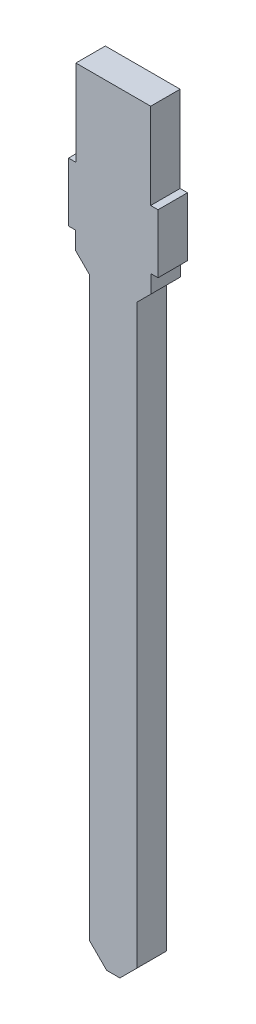
ISO-10303-21;
HEADER;
FILE_DESCRIPTION(('STEP AP214'),'2;1');
FILE_NAME('part.step','',(''),(''),'','','');
FILE_SCHEMA(('AUTOMOTIVE_DESIGN { 1 0 10303 214 1 1 1 1 }'));
ENDSEC;
DATA;
#1=APPLICATION_CONTEXT('core data for automotive mechanical design processes');
#2=APPLICATION_PROTOCOL_DEFINITION('international standard','automotive_design',2000,#1);
#3=PRODUCT_CONTEXT('',#1,'mechanical');
#4=PRODUCT('Part','Part','',(#3));
#5=PRODUCT_RELATED_PRODUCT_CATEGORY('part','',(#4));
#6=PRODUCT_DEFINITION_FORMATION('','',#4);
#7=PRODUCT_DEFINITION_CONTEXT('part definition',#1,'design');
#8=PRODUCT_DEFINITION('design','',#6,#7);
#9=PRODUCT_DEFINITION_SHAPE('','',#8);
#10=(LENGTH_UNIT() NAMED_UNIT(*) SI_UNIT(.MILLI.,.METRE.));
#11=(NAMED_UNIT(*) PLANE_ANGLE_UNIT() SI_UNIT($,.RADIAN.));
#12=(NAMED_UNIT(*) SI_UNIT($,.STERADIAN.) SOLID_ANGLE_UNIT());
#13=UNCERTAINTY_MEASURE_WITH_UNIT(LENGTH_MEASURE(1.E-05),#10,'distance_accuracy_value','');
#14=(GEOMETRIC_REPRESENTATION_CONTEXT(3) GLOBAL_UNCERTAINTY_ASSIGNED_CONTEXT((#13)) GLOBAL_UNIT_ASSIGNED_CONTEXT((#10,
#11,#12)) REPRESENTATION_CONTEXT('',''));
#15=CARTESIAN_POINT('',(0.,0.,0.));
#16=DIRECTION('',(0.,0.,1.));
#17=DIRECTION('',(1.,0.,0.));
#18=AXIS2_PLACEMENT_3D('',#15,#16,#17);
#19=CARTESIAN_POINT('',(0.399999999999999,0.287838254692783,0.5));
#20=DIRECTION('',(-0.707106781186547,0.707106781186547,0.));
#21=DIRECTION('',(-0.707106781186548,-0.707106781186548,0.));
#22=AXIS2_PLACEMENT_3D('',#19,#20,#21);
#23=PLANE('',#22);
#24=DIRECTION('',(0.707106781186547,0.707106781186547,0.));
#25=VECTOR('',#24,1.);
#26=CARTESIAN_POINT('',(0.399999999999999,0.287838254692783,0.));
#27=LINE('',#26,#25);
#28=CARTESIAN_POINT('',(0.112161745307216,0.,0.));
#29=VERTEX_POINT('',#28);
#30=CARTESIAN_POINT('',(0.399999999999999,0.287838254692783,0.));
#31=VERTEX_POINT('',#30);
#32=EDGE_CURVE('E191',#29,#31,#27,.T.);
#33=ORIENTED_EDGE('',*,*,#32,.T.);
#34=DIRECTION('',(0.,0.,-1.));
#35=VECTOR('',#34,1.);
#36=CARTESIAN_POINT('',(0.399999999999999,0.287838254692783,0.5));
#37=LINE('',#36,#35);
#38=CARTESIAN_POINT('',(0.399999999999999,0.287838254692783,0.5));
#39=VERTEX_POINT('',#38);
#40=EDGE_CURVE('E11',#39,#31,#37,.T.);
#41=ORIENTED_EDGE('',*,*,#40,.F.);
#42=DIRECTION('',(0.707106781186547,0.707106781186547,0.));
#43=VECTOR('',#42,1.);
#44=CARTESIAN_POINT('',(0.399999999999999,0.287838254692783,0.5));
#45=LINE('',#44,#43);
#46=CARTESIAN_POINT('',(0.112161745307216,0.,0.5));
#47=VERTEX_POINT('',#46);
#48=EDGE_CURVE('E225',#47,#39,#45,.T.);
#49=ORIENTED_EDGE('',*,*,#48,.F.);
#50=DIRECTION('',(0.,0.,-1.));
#51=VECTOR('',#50,1.);
#52=CARTESIAN_POINT('',(0.112161745307216,0.,0.5));
#53=LINE('',#52,#51);
#54=EDGE_CURVE('E187',#47,#29,#53,.T.);
#55=ORIENTED_EDGE('',*,*,#54,.T.);
#56=EDGE_LOOP('',(#33,#41,#49,#55));
#57=FACE_BOUND('',#56,.T.);
#58=ADVANCED_FACE('F35',(#57),#23,.F.);
#59=CARTESIAN_POINT('',(0.399999999999999,10.08,0.5));
#60=DIRECTION('',(-1.,0.,0.));
#61=DIRECTION('',(0.,0.,1.));
#62=AXIS2_PLACEMENT_3D('',#59,#60,#61);
#63=PLANE('',#62);
#64=DIRECTION('',(0.,1.,0.));
#65=VECTOR('',#64,1.);
#66=CARTESIAN_POINT('',(0.399999999999999,10.08,0.));
#67=LINE('',#66,#65);
#68=CARTESIAN_POINT('',(0.399999999999999,10.08,0.));
#69=VERTEX_POINT('',#68);
#70=EDGE_CURVE('E194',#31,#69,#67,.T.);
#71=ORIENTED_EDGE('',*,*,#70,.T.);
#72=DIRECTION('',(0.,0.,-1.));
#73=VECTOR('',#72,1.);
#74=CARTESIAN_POINT('',(0.399999999999999,10.08,0.5));
#75=LINE('',#74,#73);
#76=CARTESIAN_POINT('',(0.399999999999999,10.08,0.5));
#77=VERTEX_POINT('',#76);
#78=EDGE_CURVE('E43',#77,#69,#75,.T.);
#79=ORIENTED_EDGE('',*,*,#78,.F.);
#80=DIRECTION('',(0.,1.,0.));
#81=VECTOR('',#80,1.);
#82=CARTESIAN_POINT('',(0.399999999999999,10.08,0.5));
#83=LINE('',#82,#81);
#84=EDGE_CURVE('E124',#39,#77,#83,.T.);
#85=ORIENTED_EDGE('',*,*,#84,.F.);
#86=ORIENTED_EDGE('',*,*,#40,.T.);
#87=EDGE_LOOP('',(#71,#79,#85,#86));
#88=FACE_BOUND('',#87,.T.);
#89=ADVANCED_FACE('F333',(#88),#63,.F.);
#90=CARTESIAN_POINT('',(0.643038214383101,10.3230382143831,0.5));
#91=DIRECTION('',(-0.707106781186543,0.707106781186552,0.));
#92=DIRECTION('',(-0.707106781186552,-0.707106781186543,0.));
#93=AXIS2_PLACEMENT_3D('',#90,#91,#92);
#94=PLANE('',#93);
#95=DIRECTION('',(0.707106781186552,0.707106781186543,0.));
#96=VECTOR('',#95,1.);
#97=CARTESIAN_POINT('',(0.643038214383101,10.3230382143831,0.));
#98=LINE('',#97,#96);
#99=CARTESIAN_POINT('',(0.643038214383101,10.3230382143831,0.));
#100=VERTEX_POINT('',#99);
#101=EDGE_CURVE('E196',#69,#100,#98,.T.);
#102=ORIENTED_EDGE('',*,*,#101,.T.);
#103=DIRECTION('',(0.,0.,-1.));
#104=VECTOR('',#103,1.);
#105=CARTESIAN_POINT('',(0.643038214383101,10.3230382143831,0.5));
#106=LINE('',#105,#104);
#107=CARTESIAN_POINT('',(0.643038214383101,10.3230382143831,0.5));
#108=VERTEX_POINT('',#107);
#109=EDGE_CURVE('E262',#108,#100,#106,.T.);
#110=ORIENTED_EDGE('',*,*,#109,.F.);
#111=DIRECTION('',(0.707106781186552,0.707106781186543,0.));
#112=VECTOR('',#111,1.);
#113=CARTESIAN_POINT('',(0.643038214383101,10.3230382143831,0.5));
#114=LINE('',#113,#112);
#115=EDGE_CURVE('E270',#77,#108,#114,.T.);
#116=ORIENTED_EDGE('',*,*,#115,.F.);
#117=ORIENTED_EDGE('',*,*,#78,.T.);
#118=EDGE_LOOP('',(#102,#110,#116,#117));
#119=FACE_BOUND('',#118,.T.);
#120=ADVANCED_FACE('F268',(#119),#94,.F.);
#121=CARTESIAN_POINT('',(0.643038214383107,10.62,0.5));
#122=DIRECTION('',(-1.,0.,0.));
#123=DIRECTION('',(0.,-1.,0.));
#124=AXIS2_PLACEMENT_3D('',#121,#122,#123);
#125=PLANE('',#124);
#126=DIRECTION('',(0.,1.,0.));
#127=VECTOR('',#126,1.);
#128=CARTESIAN_POINT('',(0.643038214383107,10.62,0.));
#129=LINE('',#128,#127);
#130=CARTESIAN_POINT('',(0.643038214383107,10.62,0.));
#131=VERTEX_POINT('',#130);
#132=EDGE_CURVE('E198',#100,#131,#129,.T.);
#133=ORIENTED_EDGE('',*,*,#132,.T.);
#134=DIRECTION('',(0.,0.,-1.));
#135=VECTOR('',#134,1.);
#136=CARTESIAN_POINT('',(0.643038214383107,10.62,0.5));
#137=LINE('',#136,#135);
#138=CARTESIAN_POINT('',(0.643038214383107,10.62,0.5));
#139=VERTEX_POINT('',#138);
#140=EDGE_CURVE('E259',#139,#131,#137,.T.);
#141=ORIENTED_EDGE('',*,*,#140,.F.);
#142=DIRECTION('',(0.,1.,0.));
#143=VECTOR('',#142,1.);
#144=CARTESIAN_POINT('',(0.643038214383107,10.62,0.5));
#145=LINE('',#144,#143);
#146=EDGE_CURVE('E288',#108,#139,#145,.T.);
#147=ORIENTED_EDGE('',*,*,#146,.F.);
#148=ORIENTED_EDGE('',*,*,#109,.T.);
#149=EDGE_LOOP('',(#133,#141,#147,#148));
#150=FACE_BOUND('',#149,.T.);
#151=ADVANCED_FACE('F279',(#150),#125,.F.);
#152=CARTESIAN_POINT('',(0.759999999999999,10.62,0.5));
#153=DIRECTION('',(0.,1.,0.));
#154=DIRECTION('',(0.,0.,1.));
#155=AXIS2_PLACEMENT_3D('',#152,#153,#154);
#156=PLANE('',#155);
#157=DIRECTION('',(1.,0.,0.));
#158=VECTOR('',#157,1.);
#159=CARTESIAN_POINT('',(0.759999999999999,10.62,0.));
#160=LINE('',#159,#158);
#161=CARTESIAN_POINT('',(0.759999999999999,10.62,0.));
#162=VERTEX_POINT('',#161);
#163=EDGE_CURVE('E200',#131,#162,#160,.T.);
#164=ORIENTED_EDGE('',*,*,#163,.T.);
#165=DIRECTION('',(0.,0.,-1.));
#166=VECTOR('',#165,1.);
#167=CARTESIAN_POINT('',(0.759999999999999,10.62,0.5));
#168=LINE('',#167,#166);
#169=CARTESIAN_POINT('',(0.759999999999999,10.62,0.5));
#170=VERTEX_POINT('',#169);
#171=EDGE_CURVE('E256',#170,#162,#168,.T.);
#172=ORIENTED_EDGE('',*,*,#171,.F.);
#173=DIRECTION('',(1.,0.,0.));
#174=VECTOR('',#173,1.);
#175=CARTESIAN_POINT('',(0.759999999999999,10.62,0.5));
#176=LINE('',#175,#174);
#177=EDGE_CURVE('E285',#139,#170,#176,.T.);
#178=ORIENTED_EDGE('',*,*,#177,.F.);
#179=ORIENTED_EDGE('',*,*,#140,.T.);
#180=EDGE_LOOP('',(#164,#172,#178,#179));
#181=FACE_BOUND('',#180,.T.);
#182=ADVANCED_FACE('F283',(#181),#156,.F.);
#183=CARTESIAN_POINT('',(0.759999999999999,11.62,0.5));
#184=DIRECTION('',(-1.,0.,0.));
#185=DIRECTION('',(0.,-1.,0.));
#186=AXIS2_PLACEMENT_3D('',#183,#184,#185);
#187=PLANE('',#186);
#188=DIRECTION('',(0.,1.,0.));
#189=VECTOR('',#188,1.);
#190=CARTESIAN_POINT('',(0.759999999999999,11.62,0.));
#191=LINE('',#190,#189);
#192=CARTESIAN_POINT('',(0.759999999999999,11.62,0.));
#193=VERTEX_POINT('',#192);
#194=EDGE_CURVE('E202',#162,#193,#191,.T.);
#195=ORIENTED_EDGE('',*,*,#194,.T.);
#196=DIRECTION('',(0.,0.,-1.));
#197=VECTOR('',#196,1.);
#198=CARTESIAN_POINT('',(0.759999999999999,11.62,0.5));
#199=LINE('',#198,#197);
#200=CARTESIAN_POINT('',(0.759999999999999,11.62,0.5));
#201=VERTEX_POINT('',#200);
#202=EDGE_CURVE('E253',#201,#193,#199,.T.);
#203=ORIENTED_EDGE('',*,*,#202,.F.);
#204=DIRECTION('',(0.,1.,0.));
#205=VECTOR('',#204,1.);
#206=CARTESIAN_POINT('',(0.759999999999999,11.62,0.5));
#207=LINE('',#206,#205);
#208=EDGE_CURVE('E287',#170,#201,#207,.T.);
#209=ORIENTED_EDGE('',*,*,#208,.F.);
#210=ORIENTED_EDGE('',*,*,#171,.T.);
#211=EDGE_LOOP('',(#195,#203,#209,#210));
#212=FACE_BOUND('',#211,.T.);
#213=ADVANCED_FACE('F346',(#212),#187,.F.);
#214=CARTESIAN_POINT('',(0.635,11.62,0.5));
#215=DIRECTION('',(0.,-1.,0.));
#216=DIRECTION('',(0.,0.,-1.));
#217=AXIS2_PLACEMENT_3D('',#214,#215,#216);
#218=PLANE('',#217);
#219=DIRECTION('',(-1.,0.,0.));
#220=VECTOR('',#219,1.);
#221=CARTESIAN_POINT('',(0.635,11.62,0.));
#222=LINE('',#221,#220);
#223=CARTESIAN_POINT('',(0.635,11.62,0.));
#224=VERTEX_POINT('',#223);
#225=EDGE_CURVE('E204',#193,#224,#222,.T.);
#226=ORIENTED_EDGE('',*,*,#225,.T.);
#227=DIRECTION('',(0.,0.,-1.));
#228=VECTOR('',#227,1.);
#229=CARTESIAN_POINT('',(0.635,11.62,0.5));
#230=LINE('',#229,#228);
#231=CARTESIAN_POINT('',(0.635,11.62,0.5));
#232=VERTEX_POINT('',#231);
#233=EDGE_CURVE('E250',#232,#224,#230,.T.);
#234=ORIENTED_EDGE('',*,*,#233,.F.);
#235=DIRECTION('',(-1.,0.,0.));
#236=VECTOR('',#235,1.);
#237=CARTESIAN_POINT('',(0.635,11.62,0.5));
#238=LINE('',#237,#236);
#239=EDGE_CURVE('E290',#201,#232,#238,.T.);
#240=ORIENTED_EDGE('',*,*,#239,.F.);
#241=ORIENTED_EDGE('',*,*,#202,.T.);
#242=EDGE_LOOP('',(#226,#234,#240,#241));
#243=FACE_BOUND('',#242,.T.);
#244=ADVANCED_FACE('F349',(#243),#218,.F.);
#245=CARTESIAN_POINT('',(0.635,13.08,0.5));
#246=DIRECTION('',(-1.,0.,0.));
#247=DIRECTION('',(0.,-1.,0.));
#248=AXIS2_PLACEMENT_3D('',#245,#246,#247);
#249=PLANE('',#248);
#250=DIRECTION('',(0.,1.,0.));
#251=VECTOR('',#250,1.);
#252=CARTESIAN_POINT('',(0.635,13.08,0.));
#253=LINE('',#252,#251);
#254=CARTESIAN_POINT('',(0.635,13.08,0.));
#255=VERTEX_POINT('',#254);
#256=EDGE_CURVE('E206',#224,#255,#253,.T.);
#257=ORIENTED_EDGE('',*,*,#256,.T.);
#258=DIRECTION('',(0.,0.,-1.));
#259=VECTOR('',#258,1.);
#260=CARTESIAN_POINT('',(0.635,13.08,0.5));
#261=LINE('',#260,#259);
#262=CARTESIAN_POINT('',(0.635,13.08,0.5));
#263=VERTEX_POINT('',#262);
#264=EDGE_CURVE('E247',#263,#255,#261,.T.);
#265=ORIENTED_EDGE('',*,*,#264,.F.);
#266=DIRECTION('',(0.,1.,0.));
#267=VECTOR('',#266,1.);
#268=CARTESIAN_POINT('',(0.635,13.08,0.5));
#269=LINE('',#268,#267);
#270=EDGE_CURVE('E296',#232,#263,#269,.T.);
#271=ORIENTED_EDGE('',*,*,#270,.F.);
#272=ORIENTED_EDGE('',*,*,#233,.T.);
#273=EDGE_LOOP('',(#257,#265,#271,#272));
#274=FACE_BOUND('',#273,.T.);
#275=ADVANCED_FACE('F353',(#274),#249,.F.);
#276=CARTESIAN_POINT('',(-0.635,13.08,0.5));
#277=DIRECTION('',(0.,-1.,0.));
#278=DIRECTION('',(1.,0.,0.));
#279=AXIS2_PLACEMENT_3D('',#276,#277,#278);
#280=PLANE('',#279);
#281=DIRECTION('',(-1.,0.,0.));
#282=VECTOR('',#281,1.);
#283=CARTESIAN_POINT('',(-0.635,13.08,0.));
#284=LINE('',#283,#282);
#285=CARTESIAN_POINT('',(-0.635,13.08,0.));
#286=VERTEX_POINT('',#285);
#287=EDGE_CURVE('E208',#255,#286,#284,.T.);
#288=ORIENTED_EDGE('',*,*,#287,.T.);
#289=DIRECTION('',(0.,0.,-1.));
#290=VECTOR('',#289,1.);
#291=CARTESIAN_POINT('',(-0.635,13.08,0.5));
#292=LINE('',#291,#290);
#293=CARTESIAN_POINT('',(-0.635,13.08,0.5));
#294=VERTEX_POINT('',#293);
#295=EDGE_CURVE('E244',#294,#286,#292,.T.);
#296=ORIENTED_EDGE('',*,*,#295,.F.);
#297=DIRECTION('',(-1.,0.,0.));
#298=VECTOR('',#297,1.);
#299=CARTESIAN_POINT('',(-0.635,13.08,0.5));
#300=LINE('',#299,#298);
#301=EDGE_CURVE('E298',#263,#294,#300,.T.);
#302=ORIENTED_EDGE('',*,*,#301,.F.);
#303=ORIENTED_EDGE('',*,*,#264,.T.);
#304=EDGE_LOOP('',(#288,#296,#302,#303));
#305=FACE_BOUND('',#304,.T.);
#306=ADVANCED_FACE('F357',(#305),#280,.F.);
#307=CARTESIAN_POINT('',(-0.635,13.08,0.5));
#308=DIRECTION('',(1.,0.,0.));
#309=DIRECTION('',(0.,1.,0.));
#310=AXIS2_PLACEMENT_3D('',#307,#308,#309);
#311=PLANE('',#310);
#312=DIRECTION('',(0.,-1.,0.));
#313=VECTOR('',#312,1.);
#314=CARTESIAN_POINT('',(-0.635,13.08,0.));
#315=LINE('',#314,#313);
#316=CARTESIAN_POINT('',(-0.635,11.62,0.));
#317=VERTEX_POINT('',#316);
#318=EDGE_CURVE('E210',#286,#317,#315,.T.);
#319=ORIENTED_EDGE('',*,*,#318,.T.);
#320=DIRECTION('',(0.,0.,-1.));
#321=VECTOR('',#320,1.);
#322=CARTESIAN_POINT('',(-0.635,11.62,0.5));
#323=LINE('',#322,#321);
#324=CARTESIAN_POINT('',(-0.635,11.62,0.5));
#325=VERTEX_POINT('',#324);
#326=EDGE_CURVE('E241',#325,#317,#323,.T.);
#327=ORIENTED_EDGE('',*,*,#326,.F.);
#328=DIRECTION('',(0.,-1.,0.));
#329=VECTOR('',#328,1.);
#330=CARTESIAN_POINT('',(-0.635,13.08,0.5));
#331=LINE('',#330,#329);
#332=EDGE_CURVE('E300',#294,#325,#331,.T.);
#333=ORIENTED_EDGE('',*,*,#332,.F.);
#334=ORIENTED_EDGE('',*,*,#295,.T.);
#335=EDGE_LOOP('',(#319,#327,#333,#334));
#336=FACE_BOUND('',#335,.T.);
#337=ADVANCED_FACE('F361',(#336),#311,.F.);
#338=CARTESIAN_POINT('',(-0.635,11.62,0.5));
#339=DIRECTION('',(0.,-1.,0.));
#340=DIRECTION('',(0.,0.,-1.));
#341=AXIS2_PLACEMENT_3D('',#338,#339,#340);
#342=PLANE('',#341);
#343=DIRECTION('',(-1.,0.,0.));
#344=VECTOR('',#343,1.);
#345=CARTESIAN_POINT('',(-0.635,11.62,0.));
#346=LINE('',#345,#344);
#347=CARTESIAN_POINT('',(-0.759999999999999,11.62,0.));
#348=VERTEX_POINT('',#347);
#349=EDGE_CURVE('E212',#317,#348,#346,.T.);
#350=ORIENTED_EDGE('',*,*,#349,.T.);
#351=DIRECTION('',(0.,0.,-1.));
#352=VECTOR('',#351,1.);
#353=CARTESIAN_POINT('',(-0.759999999999999,11.62,0.5));
#354=LINE('',#353,#352);
#355=CARTESIAN_POINT('',(-0.759999999999999,11.62,0.5));
#356=VERTEX_POINT('',#355);
#357=EDGE_CURVE('E238',#356,#348,#354,.T.);
#358=ORIENTED_EDGE('',*,*,#357,.F.);
#359=DIRECTION('',(-1.,0.,0.));
#360=VECTOR('',#359,1.);
#361=CARTESIAN_POINT('',(-0.635,11.62,0.5));
#362=LINE('',#361,#360);
#363=EDGE_CURVE('E302',#325,#356,#362,.T.);
#364=ORIENTED_EDGE('',*,*,#363,.F.);
#365=ORIENTED_EDGE('',*,*,#326,.T.);
#366=EDGE_LOOP('',(#350,#358,#364,#365));
#367=FACE_BOUND('',#366,.T.);
#368=ADVANCED_FACE('F365',(#367),#342,.F.);
#369=CARTESIAN_POINT('',(-0.759999999999999,11.62,0.5));
#370=DIRECTION('',(1.,0.,0.));
#371=DIRECTION('',(0.,1.,0.));
#372=AXIS2_PLACEMENT_3D('',#369,#370,#371);
#373=PLANE('',#372);
#374=DIRECTION('',(0.,-1.,0.));
#375=VECTOR('',#374,1.);
#376=CARTESIAN_POINT('',(-0.759999999999999,11.62,0.));
#377=LINE('',#376,#375);
#378=CARTESIAN_POINT('',(-0.759999999999999,10.62,0.));
#379=VERTEX_POINT('',#378);
#380=EDGE_CURVE('E214',#348,#379,#377,.T.);
#381=ORIENTED_EDGE('',*,*,#380,.T.);
#382=DIRECTION('',(0.,0.,-1.));
#383=VECTOR('',#382,1.);
#384=CARTESIAN_POINT('',(-0.759999999999999,10.62,0.5));
#385=LINE('',#384,#383);
#386=CARTESIAN_POINT('',(-0.759999999999999,10.62,0.5));
#387=VERTEX_POINT('',#386);
#388=EDGE_CURVE('E235',#387,#379,#385,.T.);
#389=ORIENTED_EDGE('',*,*,#388,.F.);
#390=DIRECTION('',(0.,-1.,0.));
#391=VECTOR('',#390,1.);
#392=CARTESIAN_POINT('',(-0.759999999999999,11.62,0.5));
#393=LINE('',#392,#391);
#394=EDGE_CURVE('E304',#356,#387,#393,.T.);
#395=ORIENTED_EDGE('',*,*,#394,.F.);
#396=ORIENTED_EDGE('',*,*,#357,.T.);
#397=EDGE_LOOP('',(#381,#389,#395,#396));
#398=FACE_BOUND('',#397,.T.);
#399=ADVANCED_FACE('F369',(#398),#373,.F.);
#400=CARTESIAN_POINT('',(-0.759999999999999,10.62,0.5));
#401=DIRECTION('',(0.,1.,0.));
#402=DIRECTION('',(0.,0.,1.));
#403=AXIS2_PLACEMENT_3D('',#400,#401,#402);
#404=PLANE('',#403);
#405=DIRECTION('',(1.,0.,0.));
#406=VECTOR('',#405,1.);
#407=CARTESIAN_POINT('',(-0.759999999999999,10.62,0.));
#408=LINE('',#407,#406);
#409=CARTESIAN_POINT('',(-0.643038214383107,10.62,0.));
#410=VERTEX_POINT('',#409);
#411=EDGE_CURVE('E216',#379,#410,#408,.T.);
#412=ORIENTED_EDGE('',*,*,#411,.T.);
#413=DIRECTION('',(0.,0.,-1.));
#414=VECTOR('',#413,1.);
#415=CARTESIAN_POINT('',(-0.643038214383107,10.62,0.5));
#416=LINE('',#415,#414);
#417=CARTESIAN_POINT('',(-0.643038214383107,10.62,0.5));
#418=VERTEX_POINT('',#417);
#419=EDGE_CURVE('E232',#418,#410,#416,.T.);
#420=ORIENTED_EDGE('',*,*,#419,.F.);
#421=DIRECTION('',(1.,0.,0.));
#422=VECTOR('',#421,1.);
#423=CARTESIAN_POINT('',(-0.759999999999999,10.62,0.5));
#424=LINE('',#423,#422);
#425=EDGE_CURVE('E306',#387,#418,#424,.T.);
#426=ORIENTED_EDGE('',*,*,#425,.F.);
#427=ORIENTED_EDGE('',*,*,#388,.T.);
#428=EDGE_LOOP('',(#412,#420,#426,#427));
#429=FACE_BOUND('',#428,.T.);
#430=ADVANCED_FACE('F373',(#429),#404,.F.);
#431=CARTESIAN_POINT('',(-0.643038214383107,10.62,0.5));
#432=DIRECTION('',(1.,0.,0.));
#433=DIRECTION('',(0.,1.,0.));
#434=AXIS2_PLACEMENT_3D('',#431,#432,#433);
#435=PLANE('',#434);
#436=DIRECTION('',(0.,-1.,0.));
#437=VECTOR('',#436,1.);
#438=CARTESIAN_POINT('',(-0.643038214383107,10.62,0.));
#439=LINE('',#438,#437);
#440=CARTESIAN_POINT('',(-0.643038214383101,10.3230382143831,0.));
#441=VERTEX_POINT('',#440);
#442=EDGE_CURVE('E218',#410,#441,#439,.T.);
#443=ORIENTED_EDGE('',*,*,#442,.T.);
#444=DIRECTION('',(0.,0.,-1.));
#445=VECTOR('',#444,1.);
#446=CARTESIAN_POINT('',(-0.643038214383101,10.3230382143831,0.5));
#447=LINE('',#446,#445);
#448=CARTESIAN_POINT('',(-0.643038214383101,10.3230382143831,0.5));
#449=VERTEX_POINT('',#448);
#450=EDGE_CURVE('E229',#449,#441,#447,.T.);
#451=ORIENTED_EDGE('',*,*,#450,.F.);
#452=DIRECTION('',(0.,-1.,0.));
#453=VECTOR('',#452,1.);
#454=CARTESIAN_POINT('',(-0.643038214383107,10.62,0.5));
#455=LINE('',#454,#453);
#456=EDGE_CURVE('E308',#418,#449,#455,.T.);
#457=ORIENTED_EDGE('',*,*,#456,.F.);
#458=ORIENTED_EDGE('',*,*,#419,.T.);
#459=EDGE_LOOP('',(#443,#451,#457,#458));
#460=FACE_BOUND('',#459,.T.);
#461=ADVANCED_FACE('F314',(#460),#435,.F.);
#462=CARTESIAN_POINT('',(-0.643038214383101,10.3230382143831,0.5));
#463=DIRECTION('',(0.707106781186543,0.707106781186552,0.));
#464=DIRECTION('',(-0.707106781186552,0.707106781186543,0.));
#465=AXIS2_PLACEMENT_3D('',#462,#463,#464);
#466=PLANE('',#465);
#467=DIRECTION('',(0.707106781186552,-0.707106781186543,0.));
#468=VECTOR('',#467,1.);
#469=CARTESIAN_POINT('',(-0.643038214383101,10.3230382143831,0.));
#470=LINE('',#469,#468);
#471=CARTESIAN_POINT('',(-0.399999999999999,10.08,0.));
#472=VERTEX_POINT('',#471);
#473=EDGE_CURVE('E220',#441,#472,#470,.T.);
#474=ORIENTED_EDGE('',*,*,#473,.T.);
#475=DIRECTION('',(0.,0.,-1.));
#476=VECTOR('',#475,1.);
#477=CARTESIAN_POINT('',(-0.399999999999999,10.08,0.5));
#478=LINE('',#477,#476);
#479=CARTESIAN_POINT('',(-0.399999999999999,10.08,0.5));
#480=VERTEX_POINT('',#479);
#481=EDGE_CURVE('E182',#480,#472,#478,.T.);
#482=ORIENTED_EDGE('',*,*,#481,.F.);
#483=DIRECTION('',(0.707106781186552,-0.707106781186543,0.));
#484=VECTOR('',#483,1.);
#485=CARTESIAN_POINT('',(-0.643038214383101,10.3230382143831,0.5));
#486=LINE('',#485,#484);
#487=EDGE_CURVE('E173',#449,#480,#486,.T.);
#488=ORIENTED_EDGE('',*,*,#487,.F.);
#489=ORIENTED_EDGE('',*,*,#450,.T.);
#490=EDGE_LOOP('',(#474,#482,#488,#489));
#491=FACE_BOUND('',#490,.T.);
#492=ADVANCED_FACE('F318',(#491),#466,.F.);
#493=CARTESIAN_POINT('',(-0.399999999999999,10.08,0.5));
#494=DIRECTION('',(1.,0.,0.));
#495=DIRECTION('',(0.,0.,-1.));
#496=AXIS2_PLACEMENT_3D('',#493,#494,#495);
#497=PLANE('',#496);
#498=DIRECTION('',(0.,-1.,0.));
#499=VECTOR('',#498,1.);
#500=CARTESIAN_POINT('',(-0.399999999999999,10.08,0.));
#501=LINE('',#500,#499);
#502=CARTESIAN_POINT('',(-0.399999999999999,0.287838254692783,0.));
#503=VERTEX_POINT('',#502);
#504=EDGE_CURVE('E181',#472,#503,#501,.T.);
#505=ORIENTED_EDGE('',*,*,#504,.T.);
#506=DIRECTION('',(0.,0.,-1.));
#507=VECTOR('',#506,1.);
#508=CARTESIAN_POINT('',(-0.399999999999999,0.287838254692783,0.5));
#509=LINE('',#508,#507);
#510=CARTESIAN_POINT('',(-0.399999999999999,0.287838254692783,0.5));
#511=VERTEX_POINT('',#510);
#512=EDGE_CURVE('E178',#511,#503,#509,.T.);
#513=ORIENTED_EDGE('',*,*,#512,.F.);
#514=DIRECTION('',(0.,-1.,0.));
#515=VECTOR('',#514,1.);
#516=CARTESIAN_POINT('',(-0.399999999999999,10.08,0.5));
#517=LINE('',#516,#515);
#518=EDGE_CURVE('E167',#480,#511,#517,.T.);
#519=ORIENTED_EDGE('',*,*,#518,.F.);
#520=ORIENTED_EDGE('',*,*,#481,.T.);
#521=EDGE_LOOP('',(#505,#513,#519,#520));
#522=FACE_BOUND('',#521,.T.);
#523=ADVANCED_FACE('F179',(#522),#497,.F.);
#524=CARTESIAN_POINT('',(-0.399999999999999,0.287838254692783,0.5));
#525=DIRECTION('',(0.707106781186547,0.707106781186548,0.));
#526=DIRECTION('',(-0.707106781186548,0.707106781186547,0.));
#527=AXIS2_PLACEMENT_3D('',#524,#525,#526);
#528=PLANE('',#527);
#529=DIRECTION('',(0.707106781186548,-0.707106781186547,0.));
#530=VECTOR('',#529,1.);
#531=CARTESIAN_POINT('',(-0.399999999999999,0.287838254692783,0.));
#532=LINE('',#531,#530);
#533=CARTESIAN_POINT('',(-0.112161745307216,0.,0.));
#534=VERTEX_POINT('',#533);
#535=EDGE_CURVE('E110',#503,#534,#532,.T.);
#536=ORIENTED_EDGE('',*,*,#535,.T.);
#537=DIRECTION('',(0.,0.,-1.));
#538=VECTOR('',#537,1.);
#539=CARTESIAN_POINT('',(-0.112161745307216,0.,0.5));
#540=LINE('',#539,#538);
#541=CARTESIAN_POINT('',(-0.112161745307216,0.,0.5));
#542=VERTEX_POINT('',#541);
#543=EDGE_CURVE('E183',#542,#534,#540,.T.);
#544=ORIENTED_EDGE('',*,*,#543,.F.);
#545=DIRECTION('',(0.707106781186548,-0.707106781186547,0.));
#546=VECTOR('',#545,1.);
#547=CARTESIAN_POINT('',(-0.399999999999999,0.287838254692783,0.5));
#548=LINE('',#547,#546);
#549=EDGE_CURVE('E171',#511,#542,#548,.T.);
#550=ORIENTED_EDGE('',*,*,#549,.F.);
#551=ORIENTED_EDGE('',*,*,#512,.T.);
#552=EDGE_LOOP('',(#536,#544,#550,#551));
#553=FACE_BOUND('',#552,.T.);
#554=ADVANCED_FACE('F185',(#553),#528,.F.);
#555=CARTESIAN_POINT('',(0.112161745307216,0.,0.5));
#556=DIRECTION('',(0.,1.,0.));
#557=DIRECTION('',(0.,0.,1.));
#558=AXIS2_PLACEMENT_3D('',#555,#556,#557);
#559=PLANE('',#558);
#560=DIRECTION('',(1.,0.,0.));
#561=VECTOR('',#560,1.);
#562=CARTESIAN_POINT('',(0.112161745307216,0.,0.));
#563=LINE('',#562,#561);
#564=EDGE_CURVE('E116',#534,#29,#563,.T.);
#565=ORIENTED_EDGE('',*,*,#564,.T.);
#566=ORIENTED_EDGE('',*,*,#54,.F.);
#567=DIRECTION('',(1.,0.,0.));
#568=VECTOR('',#567,1.);
#569=CARTESIAN_POINT('',(0.112161745307216,0.,0.5));
#570=LINE('',#569,#568);
#571=EDGE_CURVE('E51',#542,#47,#570,.T.);
#572=ORIENTED_EDGE('',*,*,#571,.F.);
#573=ORIENTED_EDGE('',*,*,#543,.T.);
#574=EDGE_LOOP('',(#565,#566,#572,#573));
#575=FACE_BOUND('',#574,.T.);
#576=ADVANCED_FACE('F322',(#575),#559,.F.);
#577=CARTESIAN_POINT('',(0.,0.,0.5));
#578=DIRECTION('',(0.,0.,1.));
#579=DIRECTION('',(1.,0.,0.));
#580=AXIS2_PLACEMENT_3D('',#577,#578,#579);
#581=PLANE('',#580);
#582=ORIENTED_EDGE('',*,*,#48,.T.);
#583=ORIENTED_EDGE('',*,*,#84,.T.);
#584=ORIENTED_EDGE('',*,*,#115,.T.);
#585=ORIENTED_EDGE('',*,*,#146,.T.);
#586=ORIENTED_EDGE('',*,*,#177,.T.);
#587=ORIENTED_EDGE('',*,*,#208,.T.);
#588=ORIENTED_EDGE('',*,*,#239,.T.);
#589=ORIENTED_EDGE('',*,*,#270,.T.);
#590=ORIENTED_EDGE('',*,*,#301,.T.);
#591=ORIENTED_EDGE('',*,*,#332,.T.);
#592=ORIENTED_EDGE('',*,*,#363,.T.);
#593=ORIENTED_EDGE('',*,*,#394,.T.);
#594=ORIENTED_EDGE('',*,*,#425,.T.);
#595=ORIENTED_EDGE('',*,*,#456,.T.);
#596=ORIENTED_EDGE('',*,*,#487,.T.);
#597=ORIENTED_EDGE('',*,*,#518,.T.);
#598=ORIENTED_EDGE('',*,*,#549,.T.);
#599=ORIENTED_EDGE('',*,*,#571,.T.);
#600=EDGE_LOOP('',(#582,#583,#584,#585,#586,#587,#588,#589,#590,#591,#592,#593,#594,#595,#596,
#597,#598,#599));
#601=FACE_BOUND('',#600,.T.);
#602=ADVANCED_FACE('F169',(#601),#581,.T.);
#603=CARTESIAN_POINT('',(0.,0.,0.));
#604=DIRECTION('',(0.,0.,1.));
#605=DIRECTION('',(1.,0.,0.));
#606=AXIS2_PLACEMENT_3D('',#603,#604,#605);
#607=PLANE('',#606);
#608=ORIENTED_EDGE('',*,*,#32,.F.);
#609=ORIENTED_EDGE('',*,*,#564,.F.);
#610=ORIENTED_EDGE('',*,*,#535,.F.);
#611=ORIENTED_EDGE('',*,*,#504,.F.);
#612=ORIENTED_EDGE('',*,*,#473,.F.);
#613=ORIENTED_EDGE('',*,*,#442,.F.);
#614=ORIENTED_EDGE('',*,*,#411,.F.);
#615=ORIENTED_EDGE('',*,*,#380,.F.);
#616=ORIENTED_EDGE('',*,*,#349,.F.);
#617=ORIENTED_EDGE('',*,*,#318,.F.);
#618=ORIENTED_EDGE('',*,*,#287,.F.);
#619=ORIENTED_EDGE('',*,*,#256,.F.);
#620=ORIENTED_EDGE('',*,*,#225,.F.);
#621=ORIENTED_EDGE('',*,*,#194,.F.);
#622=ORIENTED_EDGE('',*,*,#163,.F.);
#623=ORIENTED_EDGE('',*,*,#132,.F.);
#624=ORIENTED_EDGE('',*,*,#101,.F.);
#625=ORIENTED_EDGE('',*,*,#70,.F.);
#626=EDGE_LOOP('',(#608,#609,#610,#611,#612,#613,#614,#615,#616,#617,#618,#619,#620,#621,#622,
#623,#624,#625));
#627=FACE_BOUND('',#626,.T.);
#628=ADVANCED_FACE('F274',(#627),#607,.F.);
#629=CLOSED_SHELL('',(#58,#89,#120,#151,#182,#213,#244,#275,#306,#337,#368,#399,#430,#461,#492,
#523,#554,#576,#602,#628));
#630=MANIFOLD_SOLID_BREP('B2',#629);
#631=ADVANCED_BREP_SHAPE_REPRESENTATION('',(#18,#630),#14);
#632=SHAPE_DEFINITION_REPRESENTATION(#9,#631);
ENDSEC;
END-ISO-10303-21;
